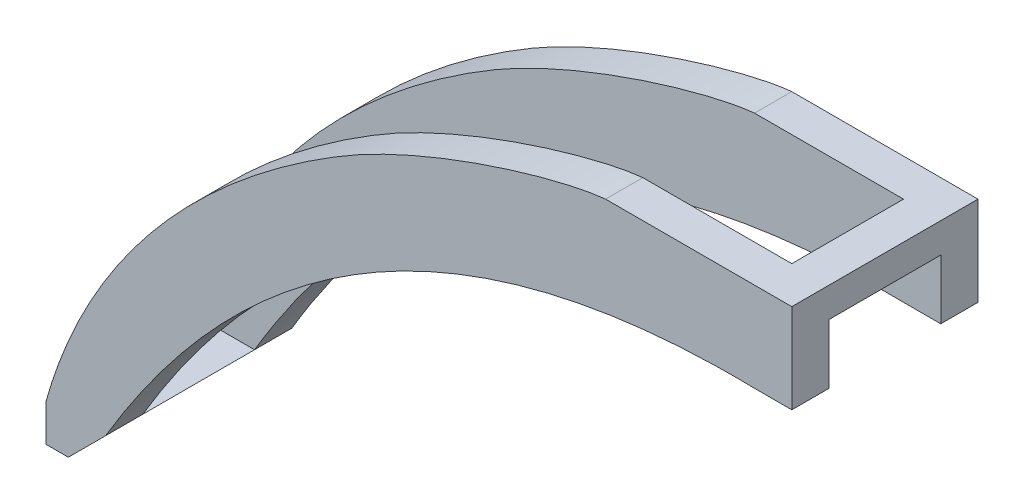
ISO-10303-21;
HEADER;
FILE_DESCRIPTION(('STEP AP214'),'2;1');
FILE_NAME('part.step','',(''),(''),'','','');
FILE_SCHEMA(('AUTOMOTIVE_DESIGN { 1 0 10303 214 1 1 1 1 }'));
ENDSEC;
DATA;
#1=APPLICATION_CONTEXT('core data for automotive mechanical design processes');
#2=APPLICATION_PROTOCOL_DEFINITION('international standard','automotive_design',2000,#1);
#3=PRODUCT_CONTEXT('',#1,'mechanical');
#4=PRODUCT('Part','Part','',(#3));
#5=PRODUCT_RELATED_PRODUCT_CATEGORY('part','',(#4));
#6=PRODUCT_DEFINITION_FORMATION('','',#4);
#7=PRODUCT_DEFINITION_CONTEXT('part definition',#1,'design');
#8=PRODUCT_DEFINITION('design','',#6,#7);
#9=PRODUCT_DEFINITION_SHAPE('','',#8);
#10=(LENGTH_UNIT() NAMED_UNIT(*) SI_UNIT(.MILLI.,.METRE.));
#11=(NAMED_UNIT(*) PLANE_ANGLE_UNIT() SI_UNIT($,.RADIAN.));
#12=(NAMED_UNIT(*) SI_UNIT($,.STERADIAN.) SOLID_ANGLE_UNIT());
#13=UNCERTAINTY_MEASURE_WITH_UNIT(LENGTH_MEASURE(1.E-05),#10,'distance_accuracy_value','');
#14=(GEOMETRIC_REPRESENTATION_CONTEXT(3) GLOBAL_UNCERTAINTY_ASSIGNED_CONTEXT((#13)) GLOBAL_UNIT_ASSIGNED_CONTEXT((#10,
#11,#12)) REPRESENTATION_CONTEXT('',''));
#15=CARTESIAN_POINT('',(0.,0.,0.));
#16=DIRECTION('',(0.,0.,1.));
#17=DIRECTION('',(1.,0.,0.));
#18=AXIS2_PLACEMENT_3D('',#15,#16,#17);
#19=CARTESIAN_POINT('',(16.7954894639838,52.1596731734823,5.));
#20=DIRECTION('',(0.,1.,0.));
#21=DIRECTION('',(0.,0.,1.));
#22=AXIS2_PLACEMENT_3D('',#19,#20,#21);
#23=PLANE('',#22);
#24=DIRECTION('',(0.,0.,-1.));
#25=VECTOR('',#24,1.);
#26=CARTESIAN_POINT('',(16.7954894639838,52.1596731734823,5.));
#27=LINE('',#26,#25);
#28=CARTESIAN_POINT('',(16.7954894639838,52.1596731734823,-15.));
#29=VERTEX_POINT('',#28);
#30=CARTESIAN_POINT('',(16.7954894639838,52.1596731734823,-20.));
#31=VERTEX_POINT('',#30);
#32=EDGE_CURVE('E154',#29,#31,#27,.T.);
#33=ORIENTED_EDGE('',*,*,#32,.F.);
#34=DIRECTION('',(1.,0.,0.));
#35=VECTOR('',#34,1.);
#36=CARTESIAN_POINT('',(16.7964894639838,52.1596731734823,-15.));
#37=LINE('',#36,#35);
#38=CARTESIAN_POINT('',(11.7954894641086,52.1596731732869,-15.));
#39=VERTEX_POINT('',#38);
#40=EDGE_CURVE('E149',#39,#29,#37,.T.);
#41=ORIENTED_EDGE('',*,*,#40,.F.);
#42=DIRECTION('',(0.,0.,-1.));
#43=VECTOR('',#42,1.);
#44=CARTESIAN_POINT('',(11.7954894641086,52.1596731732869,-15.));
#45=LINE('',#44,#43);
#46=CARTESIAN_POINT('',(11.7954894641086,52.1596731732869,-20.));
#47=VERTEX_POINT('',#46);
#48=EDGE_CURVE('E152',#39,#47,#45,.T.);
#49=ORIENTED_EDGE('',*,*,#48,.T.);
#50=DIRECTION('',(-1.,0.,0.));
#51=VECTOR('',#50,1.);
#52=CARTESIAN_POINT('',(16.7954894639838,52.1596731734823,-20.));
#53=LINE('',#52,#51);
#54=EDGE_CURVE('E309',#31,#47,#53,.T.);
#55=ORIENTED_EDGE('',*,*,#54,.F.);
#56=EDGE_LOOP('',(#33,#41,#49,#55));
#57=FACE_BOUND('',#56,.T.);
#58=ADVANCED_FACE('F33',(#57),#23,.F.);
#59=CARTESIAN_POINT('',(11.7954894639838,64.1596731734823,5.));
#60=DIRECTION('',(-1.,0.,0.));
#61=DIRECTION('',(0.,0.,1.));
#62=AXIS2_PLACEMENT_3D('',#59,#60,#61);
#63=PLANE('',#62);
#64=DIRECTION('',(0.,0.,-1.));
#65=VECTOR('',#64,1.);
#66=CARTESIAN_POINT('',(11.7954894639838,60.1596731734823,-15.));
#67=LINE('',#66,#65);
#68=CARTESIAN_POINT('',(11.7954894639838,60.1596731734823,0.));
#69=VERTEX_POINT('',#68);
#70=CARTESIAN_POINT('',(11.7954894639838,60.1596731734823,-15.));
#71=VERTEX_POINT('',#70);
#72=EDGE_CURVE('E50',#69,#71,#67,.T.);
#73=ORIENTED_EDGE('',*,*,#72,.F.);
#74=DIRECTION('',(0.,1.,0.));
#75=VECTOR('',#74,1.);
#76=CARTESIAN_POINT('',(11.7954894639838,59.1596731734823,0.));
#77=LINE('',#76,#75);
#78=CARTESIAN_POINT('',(11.7954894639838,64.1596731734823,0.));
#79=VERTEX_POINT('',#78);
#80=EDGE_CURVE('E37',#69,#79,#77,.T.);
#81=ORIENTED_EDGE('',*,*,#80,.T.);
#82=DIRECTION('',(0.,0.,1.));
#83=VECTOR('',#82,1.);
#84=CARTESIAN_POINT('',(11.7954894639838,64.1596731734823,5.));
#85=LINE('',#84,#83);
#86=CARTESIAN_POINT('',(11.7954894639838,64.1596731734823,-15.));
#87=VERTEX_POINT('',#86);
#88=EDGE_CURVE('E167',#87,#79,#85,.T.);
#89=ORIENTED_EDGE('',*,*,#88,.F.);
#90=DIRECTION('',(1.03967760325184E-11,-1.,0.));
#91=VECTOR('',#90,1.);
#92=CARTESIAN_POINT('',(11.7954894639838,64.1596731734823,-15.));
#93=LINE('',#92,#91);
#94=EDGE_CURVE('E183',#87,#71,#93,.T.);
#95=ORIENTED_EDGE('',*,*,#94,.T.);
#96=EDGE_LOOP('',(#73,#81,#89,#95));
#97=FACE_BOUND('',#96,.T.);
#98=ADVANCED_FACE('F297',(#97),#63,.T.);
#99=CARTESIAN_POINT('',(-75.334078998234,3.0838308517484,5.));
#100=CARTESIAN_POINT('',(-45.4521440834036,53.3524014876082,5.));
#101=CARTESIAN_POINT('',(11.7954894639838,52.1596731734823,5.));
#102=B_SPLINE_CURVE_WITH_KNOTS('',2,(#99,#100,#101),.UNSPECIFIED.,.F.,.F.,(3,3),(0.,1.),.UNSPECIFIED.);
#103=DIRECTION('',(0.,0.,-1.));
#104=VECTOR('',#103,1.);
#105=SURFACE_OF_LINEAR_EXTRUSION('',#102,#104);
#106=CARTESIAN_POINT('',(-75.334078998234,3.0838308517484,0.));
#107=CARTESIAN_POINT('',(-45.4521440834036,53.3524014876082,0.));
#108=CARTESIAN_POINT('',(11.7954894639838,52.1596731734823,0.));
#109=B_SPLINE_CURVE_WITH_KNOTS('',2,(#106,#107,#108),.UNSPECIFIED.,.F.,.F.,(3,3),(0.,1.),.UNSPECIFIED.);
#110=CARTESIAN_POINT('',(-75.3340789475257,3.08383093701936,0.));
#111=VERTEX_POINT('',#110);
#112=CARTESIAN_POINT('',(11.7954894639838,52.1596731734823,0.));
#113=VERTEX_POINT('',#112);
#114=EDGE_CURVE('E249',#111,#113,#109,.T.);
#115=ORIENTED_EDGE('',*,*,#114,.T.);
#116=DIRECTION('',(0.,0.,-1.));
#117=VECTOR('',#116,1.);
#118=CARTESIAN_POINT('',(11.7954894639838,52.1596731734823,5.));
#119=LINE('',#118,#117);
#120=CARTESIAN_POINT('',(11.7954894639838,52.1596731734823,5.));
#121=VERTEX_POINT('',#120);
#122=EDGE_CURVE('E258',#121,#113,#119,.T.);
#123=ORIENTED_EDGE('',*,*,#122,.F.);
#124=CARTESIAN_POINT('',(-75.334078998234,3.0838308517484,5.));
#125=VERTEX_POINT('',#124);
#126=EDGE_CURVE('E299',#125,#121,#102,.T.);
#127=ORIENTED_EDGE('',*,*,#126,.F.);
#128=DIRECTION('',(0.,0.,-1.));
#129=VECTOR('',#128,1.);
#130=CARTESIAN_POINT('',(-75.334078998234,3.0838308517484,5.));
#131=LINE('',#130,#129);
#132=EDGE_CURVE('E277',#125,#111,#131,.T.);
#133=ORIENTED_EDGE('',*,*,#132,.T.);
#134=EDGE_LOOP('',(#115,#123,#127,#133));
#135=FACE_BOUND('',#134,.T.);
#136=ADVANCED_FACE('F294',(#135),#105,.F.);
#137=CARTESIAN_POINT('',(11.7954894639838,64.1596731734823,5.));
#138=DIRECTION('',(0.,-1.,0.));
#139=DIRECTION('',(0.,0.,-1.));
#140=AXIS2_PLACEMENT_3D('',#137,#138,#139);
#141=PLANE('',#140);
#142=DIRECTION('',(-1.,0.,0.));
#143=VECTOR('',#142,1.);
#144=CARTESIAN_POINT('',(11.7954894639838,64.1596731734823,0.));
#145=LINE('',#144,#143);
#146=CARTESIAN_POINT('',(-8.20451053601619,64.1596731734823,0.));
#147=VERTEX_POINT('',#146);
#148=EDGE_CURVE('E265',#79,#147,#145,.T.);
#149=ORIENTED_EDGE('',*,*,#148,.T.);
#150=DIRECTION('',(0.,0.,-1.));
#151=VECTOR('',#150,1.);
#152=CARTESIAN_POINT('',(-8.20451053601619,64.1596731734823,5.));
#153=LINE('',#152,#151);
#154=CARTESIAN_POINT('',(-8.20451053601619,64.1596731734823,5.));
#155=VERTEX_POINT('',#154);
#156=EDGE_CURVE('E262',#155,#147,#153,.T.);
#157=ORIENTED_EDGE('',*,*,#156,.F.);
#158=DIRECTION('',(-1.,0.,0.));
#159=VECTOR('',#158,1.);
#160=CARTESIAN_POINT('',(11.7954894639838,64.1596731734823,5.));
#161=LINE('',#160,#159);
#162=CARTESIAN_POINT('',(16.7954894639838,64.1596731734823,5.));
#163=VERTEX_POINT('',#162);
#164=EDGE_CURVE('E278',#163,#155,#161,.T.);
#165=ORIENTED_EDGE('',*,*,#164,.F.);
#166=DIRECTION('',(0.,0.,1.));
#167=VECTOR('',#166,1.);
#168=CARTESIAN_POINT('',(16.7954894639838,64.1596731734823,5.));
#169=LINE('',#168,#167);
#170=CARTESIAN_POINT('',(16.7954894639838,64.1596731734823,-20.));
#171=VERTEX_POINT('',#170);
#172=EDGE_CURVE('E235',#171,#163,#169,.T.);
#173=ORIENTED_EDGE('',*,*,#172,.F.);
#174=DIRECTION('',(-1.,0.,0.));
#175=VECTOR('',#174,1.);
#176=CARTESIAN_POINT('',(16.7954894639838,64.1596731734823,-20.));
#177=LINE('',#176,#175);
#178=CARTESIAN_POINT('',(-8.20451053601619,64.1596731734823,-20.));
#179=VERTEX_POINT('',#178);
#180=EDGE_CURVE('E238',#171,#179,#177,.T.);
#181=ORIENTED_EDGE('',*,*,#180,.T.);
#182=DIRECTION('',(0.,0.,-1.));
#183=VECTOR('',#182,1.);
#184=CARTESIAN_POINT('',(-8.20451053601619,64.1596731734823,-17.5));
#185=LINE('',#184,#183);
#186=CARTESIAN_POINT('',(-8.20451053601619,64.1596731734823,-15.));
#187=VERTEX_POINT('',#186);
#188=EDGE_CURVE('E168',#187,#179,#185,.T.);
#189=ORIENTED_EDGE('',*,*,#188,.F.);
#190=DIRECTION('',(1.,0.,0.));
#191=VECTOR('',#190,1.);
#192=CARTESIAN_POINT('',(-8.20451053601619,64.1596731734823,-15.));
#193=LINE('',#192,#191);
#194=EDGE_CURVE('E193',#187,#87,#193,.T.);
#195=ORIENTED_EDGE('',*,*,#194,.T.);
#196=ORIENTED_EDGE('',*,*,#88,.T.);
#197=EDGE_LOOP('',(#149,#157,#165,#173,#181,#189,#195,#196));
#198=FACE_BOUND('',#197,.T.);
#199=ADVANCED_FACE('F289',(#198),#141,.F.);
#200=CARTESIAN_POINT('',(-8.20451053601619,64.1596731734823,5.));
#201=CARTESIAN_POINT('',(-13.6508005516114,63.6624518896067,5.));
#202=CARTESIAN_POINT('',(-29.9336170075328,59.0693342279058,5.));
#203=CARTESIAN_POINT('',(-50.9671223446288,47.5075080926021,5.));
#204=CARTESIAN_POINT('',(-76.1996793427513,28.5320578509958,5.));
#205=CARTESIAN_POINT('',(-83.3340789982333,3.08383085175121,5.));
#206=B_SPLINE_CURVE_WITH_KNOTS('',3,(#200,#201,#202,#203,#204,#205),.UNSPECIFIED.,.F.,.F.,(4,1,
1,4),(0.16821162089391,0.597338570088071,0.680517407998681,1.),.UNSPECIFIED.);
#207=DIRECTION('',(0.,0.,-1.));
#208=VECTOR('',#207,1.);
#209=SURFACE_OF_LINEAR_EXTRUSION('',#206,#208);
#210=CARTESIAN_POINT('',(-8.20451053601619,64.1596731734823,0.));
#211=CARTESIAN_POINT('',(-13.6508005516114,63.6624518896067,0.));
#212=CARTESIAN_POINT('',(-29.9336170075328,59.0693342279058,0.));
#213=CARTESIAN_POINT('',(-50.9671223446288,47.5075080926021,0.));
#214=CARTESIAN_POINT('',(-76.1996793427513,28.5320578509958,0.));
#215=CARTESIAN_POINT('',(-83.3340789982333,3.08383085175121,0.));
#216=B_SPLINE_CURVE_WITH_KNOTS('',3,(#210,#211,#212,#213,#214,#215),.UNSPECIFIED.,.F.,.F.,(4,1,
1,4),(0.16821162089391,0.597338570088071,0.680517407998681,1.),.UNSPECIFIED.);
#217=CARTESIAN_POINT('',(-83.3340789982333,3.08383085175121,0.));
#218=VERTEX_POINT('',#217);
#219=EDGE_CURVE('E267',#147,#218,#216,.T.);
#220=ORIENTED_EDGE('',*,*,#219,.T.);
#221=DIRECTION('',(0.,0.,-1.));
#222=VECTOR('',#221,1.);
#223=CARTESIAN_POINT('',(-83.3340789982333,3.08383085175121,5.));
#224=LINE('',#223,#222);
#225=CARTESIAN_POINT('',(-83.3340789982333,3.08383085175121,5.));
#226=VERTEX_POINT('',#225);
#227=EDGE_CURVE('E269',#226,#218,#224,.T.);
#228=ORIENTED_EDGE('',*,*,#227,.F.);
#229=EDGE_CURVE('E272',#155,#226,#206,.T.);
#230=ORIENTED_EDGE('',*,*,#229,.F.);
#231=ORIENTED_EDGE('',*,*,#156,.T.);
#232=EDGE_LOOP('',(#220,#228,#230,#231));
#233=FACE_BOUND('',#232,.T.);
#234=ADVANCED_FACE('F284',(#233),#209,.F.);
#235=CARTESIAN_POINT('',(-38.6107194252644,40.4870767501118,5.));
#236=DIRECTION('',(0.,0.,-1.));
#237=DIRECTION('',(-1.,0.,0.));
#238=AXIS2_PLACEMENT_3D('',#235,#236,#237);
#239=PLANE('',#238);
#240=DIRECTION('',(-1.,-1.06585187048799E-08,0.));
#241=VECTOR('',#240,1.);
#242=CARTESIAN_POINT('',(-75.3340788942331,-1.91616906298064,5.));
#243=LINE('',#242,#241);
#244=CARTESIAN_POINT('',(-80.3340788942331,-1.91616911627323,5.));
#245=VERTEX_POINT('',#244);
#246=CARTESIAN_POINT('',(-83.3340789449407,-1.91616914824879,5.));
#247=VERTEX_POINT('',#246);
#248=EDGE_CURVE('E338',#245,#247,#243,.T.);
#249=ORIENTED_EDGE('',*,*,#248,.F.);
#250=DIRECTION('',(0.707106773649835,0.70710678872326,0.));
#251=VECTOR('',#250,1.);
#252=CARTESIAN_POINT('',(-80.3340788942331,-1.91616911627323,5.));
#253=LINE('',#252,#251);
#254=EDGE_CURVE('E43',#245,#125,#253,.T.);
#255=ORIENTED_EDGE('',*,*,#254,.T.);
#256=ORIENTED_EDGE('',*,*,#126,.T.);
#257=DIRECTION('',(-1.,0.,0.));
#258=VECTOR('',#257,1.);
#259=CARTESIAN_POINT('',(16.7954894639838,52.1596731734823,5.));
#260=LINE('',#259,#258);
#261=CARTESIAN_POINT('',(16.7954894639838,52.1596731734823,5.));
#262=VERTEX_POINT('',#261);
#263=EDGE_CURVE('E255',#262,#121,#260,.T.);
#264=ORIENTED_EDGE('',*,*,#263,.F.);
#265=DIRECTION('',(0.,-1.,0.));
#266=VECTOR('',#265,1.);
#267=CARTESIAN_POINT('',(16.7954894639838,52.1596731734823,5.));
#268=LINE('',#267,#266);
#269=EDGE_CURVE('E227',#163,#262,#268,.T.);
#270=ORIENTED_EDGE('',*,*,#269,.F.);
#271=ORIENTED_EDGE('',*,*,#164,.T.);
#272=ORIENTED_EDGE('',*,*,#229,.T.);
#273=DIRECTION('',(-1.06585187048799E-08,1.,0.));
#274=VECTOR('',#273,1.);
#275=CARTESIAN_POINT('',(-83.3340789449407,-1.91616914824879,5.));
#276=LINE('',#275,#274);
#277=EDGE_CURVE('E324',#247,#226,#276,.T.);
#278=ORIENTED_EDGE('',*,*,#277,.F.);
#279=EDGE_LOOP('',(#249,#255,#256,#264,#270,#271,#272,#278));
#280=FACE_BOUND('',#279,.T.);
#281=ADVANCED_FACE('F288',(#280),#239,.F.);
#282=CARTESIAN_POINT('',(-38.6107194252644,40.4870767501118,0.));
#283=DIRECTION('',(0.,0.,-1.));
#284=DIRECTION('',(-1.,0.,0.));
#285=AXIS2_PLACEMENT_3D('',#282,#283,#284);
#286=PLANE('',#285);
#287=ORIENTED_EDGE('',*,*,#114,.F.);
#288=DIRECTION('',(1.,0.,0.));
#289=VECTOR('',#288,1.);
#290=CARTESIAN_POINT('',(-75.334078998234,3.0838308517484,0.));
#291=LINE('',#290,#289);
#292=EDGE_CURVE('E304',#218,#111,#291,.T.);
#293=ORIENTED_EDGE('',*,*,#292,.F.);
#294=ORIENTED_EDGE('',*,*,#219,.F.);
#295=ORIENTED_EDGE('',*,*,#148,.F.);
#296=ORIENTED_EDGE('',*,*,#80,.F.);
#297=DIRECTION('',(-1.,0.,0.));
#298=VECTOR('',#297,1.);
#299=CARTESIAN_POINT('',(16.7964894639838,60.1596731734823,0.));
#300=LINE('',#299,#298);
#301=CARTESIAN_POINT('',(16.7954894639838,60.1596731734823,0.));
#302=VERTEX_POINT('',#301);
#303=EDGE_CURVE('E342',#302,#69,#300,.T.);
#304=ORIENTED_EDGE('',*,*,#303,.F.);
#305=DIRECTION('',(0.,-1.,0.));
#306=VECTOR('',#305,1.);
#307=CARTESIAN_POINT('',(16.7954894639838,48.7332602527822,0.));
#308=LINE('',#307,#306);
#309=CARTESIAN_POINT('',(16.7954894639838,52.1596731734823,0.));
#310=VERTEX_POINT('',#309);
#311=EDGE_CURVE('E334',#302,#310,#308,.T.);
#312=ORIENTED_EDGE('',*,*,#311,.T.);
#313=DIRECTION('',(-1.,0.,0.));
#314=VECTOR('',#313,1.);
#315=CARTESIAN_POINT('',(16.7964894639838,52.1596731734823,0.));
#316=LINE('',#315,#314);
#317=EDGE_CURVE('E159',#310,#113,#316,.T.);
#318=ORIENTED_EDGE('',*,*,#317,.T.);
#319=EDGE_LOOP('',(#287,#293,#294,#295,#296,#304,#312,#318));
#320=FACE_BOUND('',#319,.T.);
#321=ADVANCED_FACE('F291',(#320),#286,.T.);
#322=ORIENTED_EDGE('',*,*,#122,.T.);
#323=ORIENTED_EDGE('',*,*,#317,.F.);
#324=EDGE_CURVE('E230',#262,#310,#27,.T.);
#325=ORIENTED_EDGE('',*,*,#324,.F.);
#326=ORIENTED_EDGE('',*,*,#263,.T.);
#327=EDGE_LOOP('',(#322,#323,#325,#326));
#328=FACE_BOUND('',#327,.T.);
#329=ADVANCED_FACE('F364',(#328),#23,.F.);
#330=CARTESIAN_POINT('',(16.7954894639838,52.1596731734823,-20.));
#331=DIRECTION('',(0.,0.,1.));
#332=DIRECTION('',(1.,0.,0.));
#333=AXIS2_PLACEMENT_3D('',#330,#331,#332);
#334=PLANE('',#333);
#335=CARTESIAN_POINT('',(481039.710313946,-876734.924927276,-20.));
#336=CARTESIAN_POINT('',(-469551.696211303,882966.029160225,-20.));
#337=CARTESIAN_POINT('',(457916.526611442,-889031.195902538,-20.));
#338=B_SPLINE_CURVE_WITH_KNOTS('',2,(#335,#336,#337),.UNSPECIFIED.,.F.,.F.,(3,3),(0.,1.),.UNSPECIFIED.);
#339=CARTESIAN_POINT('',(-75.3340789475256,3.08383093701936,-20.));
#340=VERTEX_POINT('',#339);
#341=EDGE_CURVE('E166',#47,#340,#338,.T.);
#342=ORIENTED_EDGE('',*,*,#341,.T.);
#343=DIRECTION('',(-0.707106773649835,-0.70710678872326,0.));
#344=VECTOR('',#343,1.);
#345=CARTESIAN_POINT('',(-80.3340788942331,-1.91616911627323,-20.));
#346=LINE('',#345,#344);
#347=CARTESIAN_POINT('',(-80.3340788942331,-1.91616911627323,-20.));
#348=VERTEX_POINT('',#347);
#349=EDGE_CURVE('E11',#340,#348,#346,.T.);
#350=ORIENTED_EDGE('',*,*,#349,.T.);
#351=DIRECTION('',(1.,1.06585187048799E-08,0.));
#352=VECTOR('',#351,1.);
#353=CARTESIAN_POINT('',(-75.3340788942331,-1.91616906298064,-20.));
#354=LINE('',#353,#352);
#355=CARTESIAN_POINT('',(-83.3340789449407,-1.91616914824879,-20.));
#356=VERTEX_POINT('',#355);
#357=EDGE_CURVE('E321',#356,#348,#354,.T.);
#358=ORIENTED_EDGE('',*,*,#357,.F.);
#359=DIRECTION('',(-1.06585187048799E-08,1.,0.));
#360=VECTOR('',#359,1.);
#361=CARTESIAN_POINT('',(-83.3340789449407,-1.91616914824879,-20.));
#362=LINE('',#361,#360);
#363=CARTESIAN_POINT('',(-83.3340789982333,3.08383085175121,-20.));
#364=VERTEX_POINT('',#363);
#365=EDGE_CURVE('E320',#356,#364,#362,.T.);
#366=ORIENTED_EDGE('',*,*,#365,.T.);
#367=CARTESIAN_POINT('',(-83.3340789982333,3.08383085175121,-20.));
#368=CARTESIAN_POINT('',(-83.1415685399157,3.77056050837541,-20.));
#369=CARTESIAN_POINT('',(-82.938366445948,4.45429094962784,-20.));
#370=CARTESIAN_POINT('',(-82.5108522473421,5.8150715468677,-20.));
#371=CARTESIAN_POINT('',(-82.2865415128178,6.49212213328196,-20.));
#372=CARTESIAN_POINT('',(-81.8170631024678,7.83893650577647,-20.));
#373=CARTESIAN_POINT('',(-81.5718958576405,8.5087004421124,-20.));
#374=CARTESIAN_POINT('',(-81.0613334512079,9.83960519157427,-20.));
#375=CARTESIAN_POINT('',(-80.7959613962168,10.5007548717114,-20.));
#376=CARTESIAN_POINT('',(-80.2451418103385,11.8146473580463,-20.));
#377=CARTESIAN_POINT('',(-79.9596940716639,12.4673900771477,-20.));
#378=CARTESIAN_POINT('',(-79.3691900920678,13.7639248208292,-20.));
#379=CARTESIAN_POINT('',(-79.0641339727343,14.4077169008806,-20.));
#380=CARTESIAN_POINT('',(-78.2812542534586,15.9979976464581,-20.));
#381=CARTESIAN_POINT('',(-77.7918045595276,16.9387902256681,-20.));
#382=CARTESIAN_POINT('',(-76.7723569368862,18.7981591443916,-20.));
#383=CARTESIAN_POINT('',(-76.2423568079062,19.7167342748206,-20.));
#384=CARTESIAN_POINT('',(-75.1436177864442,21.5307715991484,-20.));
#385=CARTESIAN_POINT('',(-74.5748678198484,22.4262270841297,-20.));
#386=CARTESIAN_POINT('',(-73.4008655590481,24.1927682924198,-20.));
#387=CARTESIAN_POINT('',(-72.7956151054791,25.0638552413403,-20.));
#388=CARTESIAN_POINT('',(-71.3470504808305,27.0618633519878,-20.));
#389=CARTESIAN_POINT('',(-70.4906102441514,28.179293977185,-20.));
#390=CARTESIAN_POINT('',(-68.7220554711207,30.3688473761156,-20.));
#391=CARTESIAN_POINT('',(-67.8099475806831,31.4409755325466,-20.));
#392=CARTESIAN_POINT('',(-65.934897367086,33.5392399615609,-20.));
#393=CARTESIAN_POINT('',(-64.9719688468805,34.5653885836727,-20.));
#394=CARTESIAN_POINT('',(-62.9973005034439,36.5740169029585,-20.));
#395=CARTESIAN_POINT('',(-61.9854569782509,37.5563945041037,-20.));
#396=CARTESIAN_POINT('',(-59.9189024245975,39.4752506495483,-20.));
#397=CARTESIAN_POINT('',(-58.8641844892437,40.4117217444649,-20.));
#398=CARTESIAN_POINT('',(-56.7150095339843,42.2394238967973,-20.));
#399=CARTESIAN_POINT('',(-55.6205253869869,43.1306230383007,-20.));
#400=CARTESIAN_POINT('',(-53.7097559130291,44.6222157896827,-20.));
#401=CARTESIAN_POINT('',(-52.9021081762326,45.233712411927,-20.));
#402=CARTESIAN_POINT('',(-51.677648882541,46.1333073092205,-20.));
#403=CARTESIAN_POINT('',(-51.2673104247814,46.430244941103,-20.));
#404=CARTESIAN_POINT('',(-50.4424348724068,47.0182353389588,-20.));
#405=CARTESIAN_POINT('',(-50.0278977740557,47.3092880996951,-20.));
#406=CARTESIAN_POINT('',(-49.1948611029024,47.8854291834191,-20.));
#407=CARTESIAN_POINT('',(-48.7763625951223,48.1705190468831,-20.));
#408=CARTESIAN_POINT('',(-47.9354211467952,48.7348221710607,-20.));
#409=CARTESIAN_POINT('',(-47.5129782016614,49.0140354249394,-20.));
#410=CARTESIAN_POINT('',(-46.6645309172212,49.5663882124216,-20.));
#411=CARTESIAN_POINT('',(-46.2385290589674,49.8395315588302,-20.));
#412=CARTESIAN_POINT('',(-45.3828821168403,50.3800654561692,-20.));
#413=CARTESIAN_POINT('',(-44.9532369929905,50.6474559438609,-20.));
#414=CARTESIAN_POINT('',(-44.0900393619418,51.1751434045323,-20.));
#415=CARTESIAN_POINT('',(-43.6564899847645,51.4354454851312,-20.));
#416=CARTESIAN_POINT('',(-42.7845408452434,51.9477779734354,-20.));
#417=CARTESIAN_POINT('',(-42.3461412392081,52.1998086466716,-20.));
#418=CARTESIAN_POINT('',(-41.4641066092557,52.6945547857405,-20.));
#419=CARTESIAN_POINT('',(-41.0204715807747,52.9372702434519,-20.));
#420=CARTESIAN_POINT('',(-40.3512134486257,53.2941986965034,-20.));
#421=CARTESIAN_POINT('',(-40.1274891001265,53.4119861034593,-20.));
#422=CARTESIAN_POINT('',(-39.6788542696883,53.6452820503417,-20.));
#423=CARTESIAN_POINT('',(-39.4539437857038,53.7607905863369,-20.));
#424=CARTESIAN_POINT('',(-39.0030171242025,53.9897096670412,-20.));
#425=CARTESIAN_POINT('',(-38.777000788864,54.1031199005523,-20.));
#426=CARTESIAN_POINT('',(-38.3240350558121,54.3280595515567,-20.));
#427=CARTESIAN_POINT('',(-38.0970856576757,54.4395889681971,-20.));
#428=CARTESIAN_POINT('',(-37.4149084139426,54.7714411163536,-20.));
#429=CARTESIAN_POINT('',(-36.9583474999504,54.9890297815659,-20.));
#430=CARTESIAN_POINT('',(-36.0417534858803,55.4174645566322,-20.));
#431=CARTESIAN_POINT('',(-35.5817185125252,55.6283066516871,-20.));
#432=CARTESIAN_POINT('',(-34.6587205937401,56.0434720588433,-20.));
#433=CARTESIAN_POINT('',(-34.1957576625128,56.247795402536,-20.));
#434=CARTESIAN_POINT('',(-33.2669225659029,56.6503193291654,-20.));
#435=CARTESIAN_POINT('',(-32.8010491460388,56.8485170162745,-20.));
#436=CARTESIAN_POINT('',(-31.8668069823874,57.2389343495108,-20.));
#437=CARTESIAN_POINT('',(-31.3984382319611,57.4311539797238,-20.));
#438=CARTESIAN_POINT('',(-29.9897149578305,57.9992140203428,-20.));
#439=CARTESIAN_POINT('',(-29.0458573865274,58.3664063328149,-20.));
#440=CARTESIAN_POINT('',(-27.2907038950375,59.0258499419473,-20.));
#441=CARTESIAN_POINT('',(-26.4805416092615,59.3211314413805,-20.));
#442=CARTESIAN_POINT('',(-24.8550532266009,59.8957819932902,-20.));
#443=CARTESIAN_POINT('',(-24.0397299803992,60.1751591010302,-20.));
#444=CARTESIAN_POINT('',(-22.4042374763577,60.7177666516544,-20.));
#445=CARTESIAN_POINT('',(-21.5840711934668,60.9810060641692,-20.));
#446=CARTESIAN_POINT('',(-19.9389915065894,61.4905383477963,-20.));
#447=CARTESIAN_POINT('',(-19.1140811203785,61.7368409258759,-20.));
#448=CARTESIAN_POINT('',(-17.87335868455,62.0921675750579,-20.));
#449=CARTESIAN_POINT('',(-17.4595382664002,62.2081731176606,-20.));
#450=CARTESIAN_POINT('',(-16.6305301857921,62.4351701944043,-20.));
#451=CARTESIAN_POINT('',(-16.2153425513365,62.5461618305606,-20.));
#452=CARTESIAN_POINT('',(-15.3834768990295,62.7626477271671,-20.));
#453=CARTESIAN_POINT('',(-14.9667986964453,62.8681412790751,-20.));
#454=CARTESIAN_POINT('',(-14.1318800172019,63.0728995775601,-20.));
#455=CARTESIAN_POINT('',(-13.7136394309049,63.1721638779661,-20.));
#456=CARTESIAN_POINT('',(-12.8751422207918,63.3634842914876,-20.));
#457=CARTESIAN_POINT('',(-12.454884234986,63.455534482071,-20.));
#458=CARTESIAN_POINT('',(-11.8231364352645,63.5868552300878,-20.));
#459=CARTESIAN_POINT('',(-11.6123462240608,63.6294994926239,-20.));
#460=CARTESIAN_POINT('',(-11.1902553004234,63.7122239004095,-20.));
#461=CARTESIAN_POINT('',(-10.9789545746905,63.7523039780963,-20.));
#462=CARTESIAN_POINT('',(-10.5551133634233,63.8296178466221,-20.));
#463=CARTESIAN_POINT('',(-10.3425710861241,63.8668418413166,-20.));
#464=CARTESIAN_POINT('',(-9.91690233916144,63.9377245099197,-20.));
#465=CARTESIAN_POINT('',(-9.70377591282556,63.9713834412878,-20.));
#466=CARTESIAN_POINT('',(-9.38353272596863,64.0185734511261,-20.));
#467=CARTESIAN_POINT('',(-9.27665891721841,64.0337579949422,-20.));
#468=CARTESIAN_POINT('',(-9.06274183371941,64.0628718087246,-20.));
#469=CARTESIAN_POINT('',(-8.95569856227687,64.0768011028813,-20.));
#470=CARTESIAN_POINT('',(-8.74140855700813,64.1032293699772,-20.));
#471=CARTESIAN_POINT('',(-8.63416178125908,64.1157280058278,-20.));
#472=CARTESIAN_POINT('',(-8.41947813982106,64.1390339529217,-20.));
#473=CARTESIAN_POINT('',(-8.31204126206644,64.1498411526092,-20.));
#474=CARTESIAN_POINT('',(-8.20451053601619,64.1596731734823,-20.));
#475=B_SPLINE_CURVE_WITH_KNOTS('',3,(#367,#368,#369,#370,#371,#372,#373,#374,#375,#376,#377,
#378,#379,#380,#381,#382,#383,#384,#385,#386,#387,#388,#389,#390,#391,#392,#393,#394,#395,#396,
#397,#398,#399,#400,#401,#402,#403,#404,#405,#406,#407,#408,#409,#410,#411,#412,#413,#414,#415,
#416,#417,#418,#419,#420,#421,#422,#423,#424,#425,#426,#427,#428,#429,#430,#431,#432,#433,#434,
#435,#436,#437,#438,#439,#440,#441,#442,#443,#444,#445,#446,#447,#448,#449,#450,#451,#452,#453,
#454,#455,#456,#457,#458,#459,#460,#461,#462,#463,#464,#465,#466,#467,#468,#469,#470,#471,#472,
#473,#474),.UNSPECIFIED.,.F.,.F.,(4,2,2,2,2,2,2,2,2,2,2,2,2,2,2,2,2,2,2,2,2,2,2,2,2,2,2,2,2,2,2,
2,2,2,2,2,2,2,2,2,2,2,2,2,2,2,2,2,2,2,2,2,2,4),(0.,2.13951853637261,4.27889829712813,
6.41823385848316,8.5551585577085,10.6921053777826,12.8290389482963,16.0094309390456,
19.1899956206452,22.3714731031397,25.5527902849829,29.7744373883406,33.9955814701758,
38.2155849249483,42.444964990314,46.6750291129258,50.9080351066419,53.9466858390162,
55.4661624563666,56.9856404258883,58.504720874483,60.023803089738,61.5419024616609,
63.0600185128624,64.5770100608196,66.0939528621896,67.6108969860359,68.3693962082077,
69.1278967387605,69.8865088746779,70.6451213545465,72.1623328005549,73.6804309348858,
75.1985217110232,76.7173194968841,78.2361213256277,81.2740973605607,83.8608341278719,
86.4462488891891,89.0302133508105,91.6126843104025,92.9019774868229,94.1912444188242,
95.4806770908265,96.770202013451,98.0607747363152,98.705944002405,99.3511302608445,
99.9984387734018,100.645700507151,100.969535874195,101.293364999168,101.61727026766,
101.941196889794),.UNSPECIFIED.);
#476=EDGE_CURVE('E173',#364,#179,#475,.T.);
#477=ORIENTED_EDGE('',*,*,#476,.T.);
#478=ORIENTED_EDGE('',*,*,#180,.F.);
#479=DIRECTION('',(0.,1.,0.));
#480=VECTOR('',#479,1.);
#481=CARTESIAN_POINT('',(16.7954894639838,52.1596731734823,-20.));
#482=LINE('',#481,#480);
#483=EDGE_CURVE('E233',#31,#171,#482,.T.);
#484=ORIENTED_EDGE('',*,*,#483,.F.);
#485=ORIENTED_EDGE('',*,*,#54,.T.);
#486=EDGE_LOOP('',(#342,#350,#358,#366,#477,#478,#484,#485));
#487=FACE_BOUND('',#486,.T.);
#488=ADVANCED_FACE('F318',(#487),#334,.F.);
#489=CARTESIAN_POINT('',(16.7954894639838,64.1596731734823,5.));
#490=DIRECTION('',(-1.,0.,0.));
#491=DIRECTION('',(0.,0.,1.));
#492=AXIS2_PLACEMENT_3D('',#489,#490,#491);
#493=PLANE('',#492);
#494=DIRECTION('',(0.,0.,1.));
#495=VECTOR('',#494,1.);
#496=CARTESIAN_POINT('',(16.7954894639838,60.1596731734823,-15.));
#497=LINE('',#496,#495);
#498=CARTESIAN_POINT('',(16.7954894639838,60.1596731734823,-15.));
#499=VERTEX_POINT('',#498);
#500=EDGE_CURVE('E158',#499,#302,#497,.T.);
#501=ORIENTED_EDGE('',*,*,#500,.F.);
#502=DIRECTION('',(0.,1.,0.));
#503=VECTOR('',#502,1.);
#504=CARTESIAN_POINT('',(16.7954894639838,48.7332602527822,-15.));
#505=LINE('',#504,#503);
#506=EDGE_CURVE('E346',#29,#499,#505,.T.);
#507=ORIENTED_EDGE('',*,*,#506,.F.);
#508=ORIENTED_EDGE('',*,*,#32,.T.);
#509=ORIENTED_EDGE('',*,*,#483,.T.);
#510=ORIENTED_EDGE('',*,*,#172,.T.);
#511=ORIENTED_EDGE('',*,*,#269,.T.);
#512=ORIENTED_EDGE('',*,*,#324,.T.);
#513=ORIENTED_EDGE('',*,*,#311,.F.);
#514=EDGE_LOOP('',(#501,#507,#508,#509,#510,#511,#512,#513));
#515=FACE_BOUND('',#514,.T.);
#516=ADVANCED_FACE('F204',(#515),#493,.F.);
#517=CARTESIAN_POINT('',(481039.710313946,-876734.924927276,-15.));
#518=CARTESIAN_POINT('',(-469551.696211303,882966.029160225,-15.));
#519=CARTESIAN_POINT('',(457916.526611442,-889031.195902538,-15.));
#520=B_SPLINE_CURVE_WITH_KNOTS('',2,(#517,#518,#519),.UNSPECIFIED.,.F.,.F.,(3,3),(0.,1.),.UNSPECIFIED.);
#521=DIRECTION('',(0.,0.,-1.));
#522=VECTOR('',#521,1.);
#523=SURFACE_OF_LINEAR_EXTRUSION('',#520,#522);
#524=ORIENTED_EDGE('',*,*,#341,.F.);
#525=ORIENTED_EDGE('',*,*,#48,.F.);
#526=CARTESIAN_POINT('',(-75.3340789475256,3.08383093701936,-15.));
#527=VERTEX_POINT('',#526);
#528=EDGE_CURVE('E164',#39,#527,#520,.T.);
#529=ORIENTED_EDGE('',*,*,#528,.T.);
#530=DIRECTION('',(0.,0.,-1.));
#531=VECTOR('',#530,1.);
#532=CARTESIAN_POINT('',(-75.3340789475256,3.08383093701936,-15.));
#533=LINE('',#532,#531);
#534=EDGE_CURVE('E519',#527,#340,#533,.T.);
#535=ORIENTED_EDGE('',*,*,#534,.T.);
#536=EDGE_LOOP('',(#524,#525,#529,#535));
#537=FACE_BOUND('',#536,.T.);
#538=ADVANCED_FACE('F163',(#537),#523,.T.);
#539=CARTESIAN_POINT('',(-8.20451053601619,64.1596731734823,5.));
#540=CARTESIAN_POINT('',(-13.6508005516114,63.6624518896067,5.));
#541=CARTESIAN_POINT('',(-29.9336170075328,59.0693342279058,5.));
#542=CARTESIAN_POINT('',(-50.9671223446288,47.5075080926021,5.));
#543=CARTESIAN_POINT('',(-76.1996793427513,28.5320578509958,5.));
#544=CARTESIAN_POINT('',(-83.3340789982333,3.08383085175121,5.));
#545=B_SPLINE_CURVE_WITH_KNOTS('',3,(#539,#540,#541,#542,#543,#544),.UNSPECIFIED.,.F.,.F.,(4,1,
1,4),(0.16821162089391,0.597338570088071,0.680517407998681,1.),.UNSPECIFIED.);
#546=DIRECTION('',(0.,0.,-1.));
#547=VECTOR('',#546,1.);
#548=SURFACE_OF_LINEAR_EXTRUSION('',#545,#547);
#549=ORIENTED_EDGE('',*,*,#476,.F.);
#550=DIRECTION('',(0.,0.,-1.));
#551=VECTOR('',#550,1.);
#552=CARTESIAN_POINT('',(-83.3340789982333,3.08383085175121,-17.5));
#553=LINE('',#552,#551);
#554=CARTESIAN_POINT('',(-83.3340789982333,3.08383085175121,-15.));
#555=VERTEX_POINT('',#554);
#556=EDGE_CURVE('E226',#555,#364,#553,.T.);
#557=ORIENTED_EDGE('',*,*,#556,.F.);
#558=CARTESIAN_POINT('',(-83.3340789982333,3.08383085175121,-15.));
#559=CARTESIAN_POINT('',(-83.1415685399157,3.77056050837541,-15.));
#560=CARTESIAN_POINT('',(-82.938366445948,4.45429094962784,-15.));
#561=CARTESIAN_POINT('',(-82.5108522473421,5.8150715468677,-15.));
#562=CARTESIAN_POINT('',(-82.2865415128178,6.49212213328196,-15.));
#563=CARTESIAN_POINT('',(-81.8170631024678,7.83893650577647,-15.));
#564=CARTESIAN_POINT('',(-81.5718958576405,8.5087004421124,-15.));
#565=CARTESIAN_POINT('',(-81.0613334512079,9.83960519157427,-15.));
#566=CARTESIAN_POINT('',(-80.7959613962168,10.5007548717114,-15.));
#567=CARTESIAN_POINT('',(-80.2451418103385,11.8146473580463,-15.));
#568=CARTESIAN_POINT('',(-79.9596940716639,12.4673900771477,-15.));
#569=CARTESIAN_POINT('',(-79.3691900920678,13.7639248208292,-15.));
#570=CARTESIAN_POINT('',(-79.0641339727343,14.4077169008806,-15.));
#571=CARTESIAN_POINT('',(-78.2812542534586,15.9979976464581,-15.));
#572=CARTESIAN_POINT('',(-77.7918045595276,16.9387902256681,-15.));
#573=CARTESIAN_POINT('',(-76.7723569368862,18.7981591443916,-15.));
#574=CARTESIAN_POINT('',(-76.2423568079062,19.7167342748206,-15.));
#575=CARTESIAN_POINT('',(-75.1436177864442,21.5307715991484,-15.));
#576=CARTESIAN_POINT('',(-74.5748678198484,22.4262270841297,-15.));
#577=CARTESIAN_POINT('',(-73.4008655590481,24.1927682924198,-15.));
#578=CARTESIAN_POINT('',(-72.7956151054791,25.0638552413403,-15.));
#579=CARTESIAN_POINT('',(-71.3470504808305,27.0618633519878,-15.));
#580=CARTESIAN_POINT('',(-70.4906102441514,28.179293977185,-15.));
#581=CARTESIAN_POINT('',(-68.7220554711207,30.3688473761156,-15.));
#582=CARTESIAN_POINT('',(-67.8099475806831,31.4409755325466,-15.));
#583=CARTESIAN_POINT('',(-65.934897367086,33.5392399615609,-15.));
#584=CARTESIAN_POINT('',(-64.9719688468805,34.5653885836727,-15.));
#585=CARTESIAN_POINT('',(-62.9973005034439,36.5740169029585,-15.));
#586=CARTESIAN_POINT('',(-61.9854569782509,37.5563945041037,-15.));
#587=CARTESIAN_POINT('',(-59.9189024245975,39.4752506495483,-15.));
#588=CARTESIAN_POINT('',(-58.8641844892437,40.4117217444649,-15.));
#589=CARTESIAN_POINT('',(-56.7150095339843,42.2394238967973,-15.));
#590=CARTESIAN_POINT('',(-55.6205253869869,43.1306230383007,-15.));
#591=CARTESIAN_POINT('',(-53.7097559130291,44.6222157896827,-15.));
#592=CARTESIAN_POINT('',(-52.9021081762326,45.233712411927,-15.));
#593=CARTESIAN_POINT('',(-51.677648882541,46.1333073092205,-15.));
#594=CARTESIAN_POINT('',(-51.2673104247814,46.430244941103,-15.));
#595=CARTESIAN_POINT('',(-50.4424348724068,47.0182353389588,-15.));
#596=CARTESIAN_POINT('',(-50.0278977740557,47.3092880996951,-15.));
#597=CARTESIAN_POINT('',(-49.1948611029024,47.8854291834191,-15.));
#598=CARTESIAN_POINT('',(-48.7763625951223,48.1705190468831,-15.));
#599=CARTESIAN_POINT('',(-47.9354211467952,48.7348221710607,-15.));
#600=CARTESIAN_POINT('',(-47.5129782016614,49.0140354249394,-15.));
#601=CARTESIAN_POINT('',(-46.6645309172212,49.5663882124216,-15.));
#602=CARTESIAN_POINT('',(-46.2385290589674,49.8395315588302,-15.));
#603=CARTESIAN_POINT('',(-45.3828821168403,50.3800654561692,-15.));
#604=CARTESIAN_POINT('',(-44.9532369929905,50.6474559438609,-15.));
#605=CARTESIAN_POINT('',(-44.0900393619418,51.1751434045323,-15.));
#606=CARTESIAN_POINT('',(-43.6564899847645,51.4354454851312,-15.));
#607=CARTESIAN_POINT('',(-42.7845408452434,51.9477779734354,-15.));
#608=CARTESIAN_POINT('',(-42.3461412392081,52.1998086466716,-15.));
#609=CARTESIAN_POINT('',(-41.4641066092557,52.6945547857405,-15.));
#610=CARTESIAN_POINT('',(-41.0204715807747,52.9372702434519,-15.));
#611=CARTESIAN_POINT('',(-40.3512134486257,53.2941986965034,-15.));
#612=CARTESIAN_POINT('',(-40.1274891001265,53.4119861034593,-15.));
#613=CARTESIAN_POINT('',(-39.6788542696883,53.6452820503417,-15.));
#614=CARTESIAN_POINT('',(-39.4539437857038,53.7607905863369,-15.));
#615=CARTESIAN_POINT('',(-39.0030171242025,53.9897096670412,-15.));
#616=CARTESIAN_POINT('',(-38.777000788864,54.1031199005523,-15.));
#617=CARTESIAN_POINT('',(-38.3240350558121,54.3280595515567,-15.));
#618=CARTESIAN_POINT('',(-38.0970856576757,54.4395889681971,-15.));
#619=CARTESIAN_POINT('',(-37.4149084139426,54.7714411163536,-15.));
#620=CARTESIAN_POINT('',(-36.9583474999504,54.9890297815659,-15.));
#621=CARTESIAN_POINT('',(-36.0417534858803,55.4174645566322,-15.));
#622=CARTESIAN_POINT('',(-35.5817185125252,55.6283066516871,-15.));
#623=CARTESIAN_POINT('',(-34.6587205937401,56.0434720588433,-15.));
#624=CARTESIAN_POINT('',(-34.1957576625128,56.247795402536,-15.));
#625=CARTESIAN_POINT('',(-33.2669225659029,56.6503193291654,-15.));
#626=CARTESIAN_POINT('',(-32.8010491460388,56.8485170162745,-15.));
#627=CARTESIAN_POINT('',(-31.8668069823874,57.2389343495108,-15.));
#628=CARTESIAN_POINT('',(-31.3984382319611,57.4311539797238,-15.));
#629=CARTESIAN_POINT('',(-29.9897149578305,57.9992140203428,-15.));
#630=CARTESIAN_POINT('',(-29.0458573865274,58.3664063328149,-15.));
#631=CARTESIAN_POINT('',(-27.2907038950375,59.0258499419473,-15.));
#632=CARTESIAN_POINT('',(-26.4805416092615,59.3211314413805,-15.));
#633=CARTESIAN_POINT('',(-24.8550532266009,59.8957819932902,-15.));
#634=CARTESIAN_POINT('',(-24.0397299803992,60.1751591010302,-15.));
#635=CARTESIAN_POINT('',(-22.4042374763577,60.7177666516544,-15.));
#636=CARTESIAN_POINT('',(-21.5840711934668,60.9810060641692,-15.));
#637=CARTESIAN_POINT('',(-19.9389915065894,61.4905383477963,-15.));
#638=CARTESIAN_POINT('',(-19.1140811203785,61.7368409258759,-15.));
#639=CARTESIAN_POINT('',(-17.87335868455,62.0921675750579,-15.));
#640=CARTESIAN_POINT('',(-17.4595382664002,62.2081731176606,-15.));
#641=CARTESIAN_POINT('',(-16.6305301857921,62.4351701944043,-15.));
#642=CARTESIAN_POINT('',(-16.2153425513365,62.5461618305606,-15.));
#643=CARTESIAN_POINT('',(-15.3834768990295,62.7626477271671,-15.));
#644=CARTESIAN_POINT('',(-14.9667986964453,62.8681412790751,-15.));
#645=CARTESIAN_POINT('',(-14.1318800172019,63.0728995775601,-15.));
#646=CARTESIAN_POINT('',(-13.7136394309049,63.1721638779661,-15.));
#647=CARTESIAN_POINT('',(-12.8751422207918,63.3634842914876,-15.));
#648=CARTESIAN_POINT('',(-12.454884234986,63.455534482071,-15.));
#649=CARTESIAN_POINT('',(-11.8231364352645,63.5868552300878,-15.));
#650=CARTESIAN_POINT('',(-11.6123462240608,63.6294994926239,-15.));
#651=CARTESIAN_POINT('',(-11.1902553004234,63.7122239004095,-15.));
#652=CARTESIAN_POINT('',(-10.9789545746905,63.7523039780963,-15.));
#653=CARTESIAN_POINT('',(-10.5551133634233,63.8296178466221,-15.));
#654=CARTESIAN_POINT('',(-10.3425710861241,63.8668418413166,-15.));
#655=CARTESIAN_POINT('',(-9.91690233916144,63.9377245099197,-15.));
#656=CARTESIAN_POINT('',(-9.70377591282556,63.9713834412878,-15.));
#657=CARTESIAN_POINT('',(-9.38353272596863,64.0185734511261,-15.));
#658=CARTESIAN_POINT('',(-9.27665891721841,64.0337579949422,-15.));
#659=CARTESIAN_POINT('',(-9.06274183371941,64.0628718087246,-15.));
#660=CARTESIAN_POINT('',(-8.95569856227687,64.0768011028813,-15.));
#661=CARTESIAN_POINT('',(-8.74140855700813,64.1032293699772,-15.));
#662=CARTESIAN_POINT('',(-8.63416178125908,64.1157280058278,-15.));
#663=CARTESIAN_POINT('',(-8.41947813982106,64.1390339529217,-15.));
#664=CARTESIAN_POINT('',(-8.31204126206644,64.1498411526092,-15.));
#665=CARTESIAN_POINT('',(-8.20451053601619,64.1596731734823,-15.));
#666=B_SPLINE_CURVE_WITH_KNOTS('',3,(#558,#559,#560,#561,#562,#563,#564,#565,#566,#567,#568,
#569,#570,#571,#572,#573,#574,#575,#576,#577,#578,#579,#580,#581,#582,#583,#584,#585,#586,#587,
#588,#589,#590,#591,#592,#593,#594,#595,#596,#597,#598,#599,#600,#601,#602,#603,#604,#605,#606,
#607,#608,#609,#610,#611,#612,#613,#614,#615,#616,#617,#618,#619,#620,#621,#622,#623,#624,#625,
#626,#627,#628,#629,#630,#631,#632,#633,#634,#635,#636,#637,#638,#639,#640,#641,#642,#643,#644,
#645,#646,#647,#648,#649,#650,#651,#652,#653,#654,#655,#656,#657,#658,#659,#660,#661,#662,#663,
#664,#665),.UNSPECIFIED.,.F.,.F.,(4,2,2,2,2,2,2,2,2,2,2,2,2,2,2,2,2,2,2,2,2,2,2,2,2,2,2,2,2,2,2,
2,2,2,2,2,2,2,2,2,2,2,2,2,2,2,2,2,2,2,2,2,2,4),(0.,2.13951853637261,4.27889829712813,
6.41823385848316,8.5551585577085,10.6921053777826,12.8290389482963,16.0094309390456,
19.1899956206452,22.3714731031397,25.5527902849829,29.7744373883406,33.9955814701758,
38.2155849249483,42.444964990314,46.6750291129258,50.9080351066419,53.9466858390162,
55.4661624563666,56.9856404258883,58.504720874483,60.023803089738,61.5419024616609,
63.0600185128624,64.5770100608196,66.0939528621896,67.6108969860359,68.3693962082077,
69.1278967387605,69.8865088746779,70.6451213545465,72.1623328005549,73.6804309348858,
75.1985217110232,76.7173194968841,78.2361213256277,81.2740973605607,83.8608341278719,
86.4462488891891,89.0302133508105,91.6126843104025,92.9019774868229,94.1912444188242,
95.4806770908265,96.770202013451,98.0607747363152,98.705944002405,99.3511302608445,
99.9984387734018,100.645700507151,100.969535874195,101.293364999168,101.61727026766,
101.941196889794),.UNSPECIFIED.);
#667=EDGE_CURVE('E175',#555,#187,#666,.T.);
#668=ORIENTED_EDGE('',*,*,#667,.T.);
#669=ORIENTED_EDGE('',*,*,#188,.T.);
#670=EDGE_LOOP('',(#549,#557,#668,#669));
#671=FACE_BOUND('',#670,.T.);
#672=ADVANCED_FACE('F203',(#671),#548,.F.);
#673=CARTESIAN_POINT('',(-36.7888743045199,41.4843726590561,-15.));
#674=DIRECTION('',(0.,0.,-1.));
#675=DIRECTION('',(-1.,0.,0.));
#676=AXIS2_PLACEMENT_3D('',#673,#674,#675);
#677=PLANE('',#676);
#678=ORIENTED_EDGE('',*,*,#528,.F.);
#679=ORIENTED_EDGE('',*,*,#40,.T.);
#680=ORIENTED_EDGE('',*,*,#506,.T.);
#681=DIRECTION('',(-1.,0.,0.));
#682=VECTOR('',#681,1.);
#683=CARTESIAN_POINT('',(16.7964894639838,60.1596731734823,-15.));
#684=LINE('',#683,#682);
#685=EDGE_CURVE('E341',#499,#71,#684,.T.);
#686=ORIENTED_EDGE('',*,*,#685,.T.);
#687=ORIENTED_EDGE('',*,*,#94,.F.);
#688=ORIENTED_EDGE('',*,*,#194,.F.);
#689=ORIENTED_EDGE('',*,*,#667,.F.);
#690=DIRECTION('',(-1.,-1.06585187048799E-08,0.));
#691=VECTOR('',#690,1.);
#692=CARTESIAN_POINT('',(-75.3340789475256,3.08383093701936,-15.));
#693=LINE('',#692,#691);
#694=EDGE_CURVE('E172',#527,#555,#693,.T.);
#695=ORIENTED_EDGE('',*,*,#694,.F.);
#696=EDGE_LOOP('',(#678,#679,#680,#686,#687,#688,#689,#695));
#697=FACE_BOUND('',#696,.T.);
#698=ADVANCED_FACE('F170',(#697),#677,.F.);
#699=CARTESIAN_POINT('',(-75.3340789475257,3.08383093701936,5.));
#700=DIRECTION('',(1.06585187048799E-08,-1.,0.));
#701=DIRECTION('',(1.,1.06585187048799E-08,0.));
#702=AXIS2_PLACEMENT_3D('',#699,#700,#701);
#703=PLANE('',#702);
#704=ORIENTED_EDGE('',*,*,#292,.T.);
#705=DIRECTION('',(0.,0.,1.));
#706=VECTOR('',#705,1.);
#707=CARTESIAN_POINT('',(-75.3340789475257,3.08383093701936,-20.));
#708=LINE('',#707,#706);
#709=EDGE_CURVE('E332',#527,#111,#708,.T.);
#710=ORIENTED_EDGE('',*,*,#709,.F.);
#711=ORIENTED_EDGE('',*,*,#694,.T.);
#712=DIRECTION('',(0.,0.,-1.));
#713=VECTOR('',#712,1.);
#714=CARTESIAN_POINT('',(-83.3340789982333,3.08383085175121,-20.));
#715=LINE('',#714,#713);
#716=EDGE_CURVE('E190',#218,#555,#715,.T.);
#717=ORIENTED_EDGE('',*,*,#716,.F.);
#718=EDGE_LOOP('',(#704,#710,#711,#717));
#719=FACE_BOUND('',#718,.T.);
#720=ADVANCED_FACE('F404',(#719),#703,.F.);
#721=CARTESIAN_POINT('',(-83.3340789449407,-1.91616914824879,-20.));
#722=DIRECTION('',(1.,1.06585187048799E-08,0.));
#723=DIRECTION('',(-1.06585187048799E-08,1.,0.));
#724=AXIS2_PLACEMENT_3D('',#721,#722,#723);
#725=PLANE('',#724);
#726=ORIENTED_EDGE('',*,*,#227,.T.);
#727=ORIENTED_EDGE('',*,*,#716,.T.);
#728=ORIENTED_EDGE('',*,*,#556,.T.);
#729=ORIENTED_EDGE('',*,*,#365,.F.);
#730=DIRECTION('',(0.,0.,-1.));
#731=VECTOR('',#730,1.);
#732=CARTESIAN_POINT('',(-83.3340789449407,-1.91616914824879,-20.));
#733=LINE('',#732,#731);
#734=EDGE_CURVE('E328',#247,#356,#733,.T.);
#735=ORIENTED_EDGE('',*,*,#734,.F.);
#736=ORIENTED_EDGE('',*,*,#277,.T.);
#737=EDGE_LOOP('',(#726,#727,#728,#729,#735,#736));
#738=FACE_BOUND('',#737,.T.);
#739=ADVANCED_FACE('F401',(#738),#725,.F.);
#740=CARTESIAN_POINT('',(-75.3340788942331,-1.91616906298064,5.));
#741=DIRECTION('',(1.06585187048799E-08,-1.,0.));
#742=DIRECTION('',(1.,1.06585187048799E-08,0.));
#743=AXIS2_PLACEMENT_3D('',#740,#741,#742);
#744=PLANE('',#743);
#745=ORIENTED_EDGE('',*,*,#357,.T.);
#746=DIRECTION('',(0.,0.,1.));
#747=VECTOR('',#746,1.);
#748=CARTESIAN_POINT('',(-80.3340788942331,-1.91616911627323,5.));
#749=LINE('',#748,#747);
#750=EDGE_CURVE('E261',#348,#245,#749,.T.);
#751=ORIENTED_EDGE('',*,*,#750,.T.);
#752=ORIENTED_EDGE('',*,*,#248,.T.);
#753=ORIENTED_EDGE('',*,*,#734,.T.);
#754=EDGE_LOOP('',(#745,#751,#752,#753));
#755=FACE_BOUND('',#754,.T.);
#756=ADVANCED_FACE('F397',(#755),#744,.T.);
#757=CARTESIAN_POINT('',(-80.3340788942331,-1.91616911627323,5.));
#758=DIRECTION('',(0.70710678872326,-0.707106773649835,0.));
#759=DIRECTION('',(0.707106773649835,0.70710678872326,0.));
#760=AXIS2_PLACEMENT_3D('',#757,#758,#759);
#761=PLANE('',#760);
#762=ORIENTED_EDGE('',*,*,#709,.T.);
#763=ORIENTED_EDGE('',*,*,#132,.F.);
#764=ORIENTED_EDGE('',*,*,#254,.F.);
#765=ORIENTED_EDGE('',*,*,#750,.F.);
#766=ORIENTED_EDGE('',*,*,#349,.F.);
#767=ORIENTED_EDGE('',*,*,#534,.F.);
#768=EDGE_LOOP('',(#762,#763,#764,#765,#766,#767));
#769=FACE_BOUND('',#768,.T.);
#770=ADVANCED_FACE('F35',(#769),#761,.T.);
#771=CARTESIAN_POINT('',(16.7964894639838,60.1596731734823,-15.));
#772=DIRECTION('',(0.,1.,0.));
#773=DIRECTION('',(0.,0.,1.));
#774=AXIS2_PLACEMENT_3D('',#771,#772,#773);
#775=PLANE('',#774);
#776=ORIENTED_EDGE('',*,*,#500,.T.);
#777=ORIENTED_EDGE('',*,*,#303,.T.);
#778=ORIENTED_EDGE('',*,*,#72,.T.);
#779=ORIENTED_EDGE('',*,*,#685,.F.);
#780=EDGE_LOOP('',(#776,#777,#778,#779));
#781=FACE_BOUND('',#780,.T.);
#782=ADVANCED_FACE('F463',(#781),#775,.F.);
#783=CLOSED_SHELL('',(#58,#98,#136,#199,#234,#281,#321,#329,#488,#516,#538,#672,#698,#720,#739,
#756,#770,#782));
#784=MANIFOLD_SOLID_BREP('B2',#783);
#785=ADVANCED_BREP_SHAPE_REPRESENTATION('',(#18,#784),#14);
#786=SHAPE_DEFINITION_REPRESENTATION(#9,#785);
ENDSEC;
END-ISO-10303-21;
